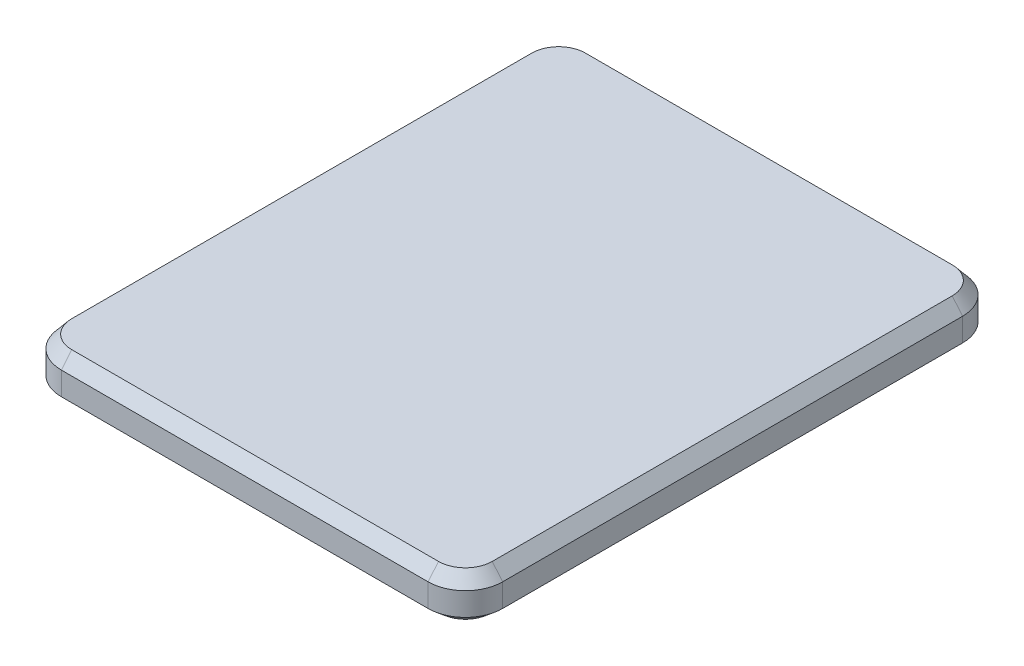
ISO-10303-21;
HEADER;
FILE_DESCRIPTION(('STEP AP214'),'2;1');
FILE_NAME('part.step','',(''),(''),'','','');
FILE_SCHEMA(('AUTOMOTIVE_DESIGN { 1 0 10303 214 1 1 1 1 }'));
ENDSEC;
DATA;
#1=APPLICATION_CONTEXT('core data for automotive mechanical design processes');
#2=APPLICATION_PROTOCOL_DEFINITION('international standard','automotive_design',2000,#1);
#3=PRODUCT_CONTEXT('',#1,'mechanical');
#4=PRODUCT('Part','Part','',(#3));
#5=PRODUCT_RELATED_PRODUCT_CATEGORY('part','',(#4));
#6=PRODUCT_DEFINITION_FORMATION('','',#4);
#7=PRODUCT_DEFINITION_CONTEXT('part definition',#1,'design');
#8=PRODUCT_DEFINITION('design','',#6,#7);
#9=PRODUCT_DEFINITION_SHAPE('','',#8);
#10=(LENGTH_UNIT() NAMED_UNIT(*) SI_UNIT(.MILLI.,.METRE.));
#11=(NAMED_UNIT(*) PLANE_ANGLE_UNIT() SI_UNIT($,.RADIAN.));
#12=(NAMED_UNIT(*) SI_UNIT($,.STERADIAN.) SOLID_ANGLE_UNIT());
#13=UNCERTAINTY_MEASURE_WITH_UNIT(LENGTH_MEASURE(1.E-05),#10,'distance_accuracy_value','');
#14=(GEOMETRIC_REPRESENTATION_CONTEXT(3) GLOBAL_UNCERTAINTY_ASSIGNED_CONTEXT((#13)) GLOBAL_UNIT_ASSIGNED_CONTEXT((#10,
#11,#12)) REPRESENTATION_CONTEXT('',''));
#15=CARTESIAN_POINT('',(0.,0.,0.));
#16=DIRECTION('',(0.,0.,1.));
#17=DIRECTION('',(1.,0.,0.));
#18=AXIS2_PLACEMENT_3D('',#15,#16,#17);
#19=CARTESIAN_POINT('',(17.75,3.7,-21.5));
#20=DIRECTION('',(-1.,0.,0.));
#21=DIRECTION('',(0.,0.,1.));
#22=AXIS2_PLACEMENT_3D('',#19,#20,#21);
#23=PLANE('',#22);
#24=DIRECTION('',(0.,-1.,0.));
#25=VECTOR('',#24,1.);
#26=CARTESIAN_POINT('',(17.75,3.7,18.5));
#27=LINE('',#26,#25);
#28=CARTESIAN_POINT('',(17.75,2.7,18.5));
#29=VERTEX_POINT('',#28);
#30=CARTESIAN_POINT('',(17.75,0.839099631177287,18.5));
#31=VERTEX_POINT('',#30);
#32=EDGE_CURVE('E296',#29,#31,#27,.T.);
#33=ORIENTED_EDGE('',*,*,#32,.T.);
#34=DIRECTION('',(0.,0.,-1.));
#35=VECTOR('',#34,1.);
#36=CARTESIAN_POINT('',(17.75,0.839099631177287,-21.5));
#37=LINE('',#36,#35);
#38=CARTESIAN_POINT('',(17.75,0.839099631177287,-18.5));
#39=VERTEX_POINT('',#38);
#40=EDGE_CURVE('E195',#31,#39,#37,.T.);
#41=ORIENTED_EDGE('',*,*,#40,.T.);
#42=DIRECTION('',(0.,-1.,0.));
#43=VECTOR('',#42,1.);
#44=CARTESIAN_POINT('',(17.75,3.7,-18.5));
#45=LINE('',#44,#43);
#46=CARTESIAN_POINT('',(17.75,2.7,-18.5));
#47=VERTEX_POINT('',#46);
#48=EDGE_CURVE('E299',#39,#47,#45,.F.);
#49=ORIENTED_EDGE('',*,*,#48,.T.);
#50=DIRECTION('',(0.,0.,1.));
#51=VECTOR('',#50,1.);
#52=CARTESIAN_POINT('',(17.75,2.7,18.5));
#53=LINE('',#52,#51);
#54=EDGE_CURVE('E193',#47,#29,#53,.T.);
#55=ORIENTED_EDGE('',*,*,#54,.T.);
#56=EDGE_LOOP('',(#33,#41,#49,#55));
#57=FACE_BOUND('',#56,.T.);
#58=ADVANCED_FACE('F37',(#57),#23,.F.);
#59=CARTESIAN_POINT('',(-17.75,3.7,-21.5));
#60=DIRECTION('',(0.,0.,1.));
#61=DIRECTION('',(1.,0.,0.));
#62=AXIS2_PLACEMENT_3D('',#59,#60,#61);
#63=PLANE('',#62);
#64=DIRECTION('',(0.,-1.,0.));
#65=VECTOR('',#64,1.);
#66=CARTESIAN_POINT('',(14.75,3.7,-21.5));
#67=LINE('',#66,#65);
#68=CARTESIAN_POINT('',(14.75,2.7,-21.5));
#69=VERTEX_POINT('',#68);
#70=CARTESIAN_POINT('',(14.75,0.839099631177287,-21.5));
#71=VERTEX_POINT('',#70);
#72=EDGE_CURVE('E288',#69,#71,#67,.T.);
#73=ORIENTED_EDGE('',*,*,#72,.T.);
#74=DIRECTION('',(-1.,0.,0.));
#75=VECTOR('',#74,1.);
#76=CARTESIAN_POINT('',(-17.75,0.839099631177287,-21.5));
#77=LINE('',#76,#75);
#78=CARTESIAN_POINT('',(-14.75,0.839099631177287,-21.5));
#79=VERTEX_POINT('',#78);
#80=EDGE_CURVE('E204',#71,#79,#77,.T.);
#81=ORIENTED_EDGE('',*,*,#80,.T.);
#82=DIRECTION('',(0.,-1.,0.));
#83=VECTOR('',#82,1.);
#84=CARTESIAN_POINT('',(-14.75,3.7,-21.5));
#85=LINE('',#84,#83);
#86=CARTESIAN_POINT('',(-14.75,2.7,-21.5));
#87=VERTEX_POINT('',#86);
#88=EDGE_CURVE('E293',#79,#87,#85,.F.);
#89=ORIENTED_EDGE('',*,*,#88,.T.);
#90=DIRECTION('',(1.,0.,0.));
#91=VECTOR('',#90,1.);
#92=CARTESIAN_POINT('',(14.75,2.7,-21.5));
#93=LINE('',#92,#91);
#94=EDGE_CURVE('E202',#87,#69,#93,.T.);
#95=ORIENTED_EDGE('',*,*,#94,.T.);
#96=EDGE_LOOP('',(#73,#81,#89,#95));
#97=FACE_BOUND('',#96,.T.);
#98=ADVANCED_FACE('F351',(#97),#63,.F.);
#99=CARTESIAN_POINT('',(-17.75,3.7,-21.5));
#100=DIRECTION('',(1.,0.,0.));
#101=DIRECTION('',(0.,0.,-1.));
#102=AXIS2_PLACEMENT_3D('',#99,#100,#101);
#103=PLANE('',#102);
#104=DIRECTION('',(0.,-1.,0.));
#105=VECTOR('',#104,1.);
#106=CARTESIAN_POINT('',(-17.75,3.7,-18.5));
#107=LINE('',#106,#105);
#108=CARTESIAN_POINT('',(-17.75,2.7,-18.5));
#109=VERTEX_POINT('',#108);
#110=CARTESIAN_POINT('',(-17.75,0.839099631177287,-18.5));
#111=VERTEX_POINT('',#110);
#112=EDGE_CURVE('E286',#109,#111,#107,.T.);
#113=ORIENTED_EDGE('',*,*,#112,.T.);
#114=DIRECTION('',(0.,0.,1.));
#115=VECTOR('',#114,1.);
#116=CARTESIAN_POINT('',(-17.75,0.839099631177287,-21.5));
#117=LINE('',#116,#115);
#118=CARTESIAN_POINT('',(-17.75,0.839099631177287,18.5));
#119=VERTEX_POINT('',#118);
#120=EDGE_CURVE('E212',#111,#119,#117,.T.);
#121=ORIENTED_EDGE('',*,*,#120,.T.);
#122=DIRECTION('',(0.,-1.,0.));
#123=VECTOR('',#122,1.);
#124=CARTESIAN_POINT('',(-17.75,3.7,18.5));
#125=LINE('',#124,#123);
#126=CARTESIAN_POINT('',(-17.75,2.7,18.5));
#127=VERTEX_POINT('',#126);
#128=EDGE_CURVE('E243',#119,#127,#125,.F.);
#129=ORIENTED_EDGE('',*,*,#128,.T.);
#130=DIRECTION('',(0.,0.,-1.));
#131=VECTOR('',#130,1.);
#132=CARTESIAN_POINT('',(-17.75,2.7,-18.5));
#133=LINE('',#132,#131);
#134=EDGE_CURVE('E210',#127,#109,#133,.T.);
#135=ORIENTED_EDGE('',*,*,#134,.T.);
#136=EDGE_LOOP('',(#113,#121,#129,#135));
#137=FACE_BOUND('',#136,.T.);
#138=ADVANCED_FACE('F284',(#137),#103,.F.);
#139=CARTESIAN_POINT('',(-17.75,3.7,21.5));
#140=DIRECTION('',(0.,0.,-1.));
#141=DIRECTION('',(-1.,0.,0.));
#142=AXIS2_PLACEMENT_3D('',#139,#140,#141);
#143=PLANE('',#142);
#144=DIRECTION('',(0.,-1.,0.));
#145=VECTOR('',#144,1.);
#146=CARTESIAN_POINT('',(-14.75,3.7,21.5));
#147=LINE('',#146,#145);
#148=CARTESIAN_POINT('',(-14.75,2.7,21.5));
#149=VERTEX_POINT('',#148);
#150=CARTESIAN_POINT('',(-14.75,0.839099631177287,21.5));
#151=VERTEX_POINT('',#150);
#152=EDGE_CURVE('E281',#149,#151,#147,.T.);
#153=ORIENTED_EDGE('',*,*,#152,.T.);
#154=DIRECTION('',(1.,0.,0.));
#155=VECTOR('',#154,1.);
#156=CARTESIAN_POINT('',(-17.75,0.839099631177287,21.5));
#157=LINE('',#156,#155);
#158=CARTESIAN_POINT('',(14.75,0.839099631177287,21.5));
#159=VERTEX_POINT('',#158);
#160=EDGE_CURVE('E187',#151,#159,#157,.T.);
#161=ORIENTED_EDGE('',*,*,#160,.T.);
#162=DIRECTION('',(0.,-1.,0.));
#163=VECTOR('',#162,1.);
#164=CARTESIAN_POINT('',(14.75,3.7,21.5));
#165=LINE('',#164,#163);
#166=CARTESIAN_POINT('',(14.75,2.7,21.5));
#167=VERTEX_POINT('',#166);
#168=EDGE_CURVE('E171',#159,#167,#165,.F.);
#169=ORIENTED_EDGE('',*,*,#168,.T.);
#170=DIRECTION('',(-1.,0.,0.));
#171=VECTOR('',#170,1.);
#172=CARTESIAN_POINT('',(-14.75,2.7,21.5));
#173=LINE('',#172,#171);
#174=EDGE_CURVE('E185',#167,#149,#173,.T.);
#175=ORIENTED_EDGE('',*,*,#174,.T.);
#176=EDGE_LOOP('',(#153,#161,#169,#175));
#177=FACE_BOUND('',#176,.T.);
#178=ADVANCED_FACE('F323',(#177),#143,.F.);
#179=CARTESIAN_POINT('',(0.,3.7,0.));
#180=DIRECTION('',(0.,1.,0.));
#181=DIRECTION('',(0.,0.,1.));
#182=AXIS2_PLACEMENT_3D('',#179,#180,#181);
#183=PLANE('',#182);
#184=DIRECTION('',(0.,0.,-1.));
#185=VECTOR('',#184,1.);
#186=CARTESIAN_POINT('',(16.9109003688227,3.7,-18.5));
#187=LINE('',#186,#185);
#188=CARTESIAN_POINT('',(16.9109003688227,3.7,18.5));
#189=VERTEX_POINT('',#188);
#190=CARTESIAN_POINT('',(16.9109003688227,3.7,-18.5));
#191=VERTEX_POINT('',#190);
#192=EDGE_CURVE('E47',#189,#191,#187,.T.);
#193=ORIENTED_EDGE('',*,*,#192,.T.);
#194=CARTESIAN_POINT('',(14.75,3.7,-18.5));
#195=DIRECTION('',(0.,1.,0.));
#196=DIRECTION('',(0.,0.,1.));
#197=AXIS2_PLACEMENT_3D('',#194,#195,#196);
#198=CIRCLE('',#197,2.16090036882272);
#199=CARTESIAN_POINT('',(14.75,3.7,-20.6609003688227));
#200=VERTEX_POINT('',#199);
#201=EDGE_CURVE('E11',#191,#200,#198,.T.);
#202=ORIENTED_EDGE('',*,*,#201,.T.);
#203=DIRECTION('',(-1.,0.,0.));
#204=VECTOR('',#203,1.);
#205=CARTESIAN_POINT('',(-14.75,3.7,-20.6609003688227));
#206=LINE('',#205,#204);
#207=CARTESIAN_POINT('',(-14.75,3.7,-20.6609003688227));
#208=VERTEX_POINT('',#207);
#209=EDGE_CURVE('E214',#200,#208,#206,.T.);
#210=ORIENTED_EDGE('',*,*,#209,.T.);
#211=CARTESIAN_POINT('',(-14.75,3.7,-18.5));
#212=DIRECTION('',(0.,1.,0.));
#213=DIRECTION('',(0.,0.,1.));
#214=AXIS2_PLACEMENT_3D('',#211,#212,#213);
#215=CIRCLE('',#214,2.16090036882272);
#216=CARTESIAN_POINT('',(-16.9109003688227,3.7,-18.5));
#217=VERTEX_POINT('',#216);
#218=EDGE_CURVE('E216',#208,#217,#215,.T.);
#219=ORIENTED_EDGE('',*,*,#218,.T.);
#220=DIRECTION('',(0.,0.,1.));
#221=VECTOR('',#220,1.);
#222=CARTESIAN_POINT('',(-16.9109003688227,3.7,18.5));
#223=LINE('',#222,#221);
#224=CARTESIAN_POINT('',(-16.9109003688227,3.7,18.5));
#225=VERTEX_POINT('',#224);
#226=EDGE_CURVE('E218',#217,#225,#223,.T.);
#227=ORIENTED_EDGE('',*,*,#226,.T.);
#228=CARTESIAN_POINT('',(-14.75,3.7,18.5));
#229=DIRECTION('',(0.,1.,0.));
#230=DIRECTION('',(0.,0.,1.));
#231=AXIS2_PLACEMENT_3D('',#228,#229,#230);
#232=CIRCLE('',#231,2.16090036882272);
#233=CARTESIAN_POINT('',(-14.75,3.7,20.6609003688227));
#234=VERTEX_POINT('',#233);
#235=EDGE_CURVE('E220',#225,#234,#232,.T.);
#236=ORIENTED_EDGE('',*,*,#235,.T.);
#237=DIRECTION('',(1.,0.,0.));
#238=VECTOR('',#237,1.);
#239=CARTESIAN_POINT('',(14.75,3.7,20.6609003688227));
#240=LINE('',#239,#238);
#241=CARTESIAN_POINT('',(14.75,3.7,20.6609003688227));
#242=VERTEX_POINT('',#241);
#243=EDGE_CURVE('E222',#234,#242,#240,.T.);
#244=ORIENTED_EDGE('',*,*,#243,.T.);
#245=CARTESIAN_POINT('',(14.75,3.7,18.5));
#246=DIRECTION('',(0.,1.,0.));
#247=DIRECTION('',(0.,0.,1.));
#248=AXIS2_PLACEMENT_3D('',#245,#246,#247);
#249=CIRCLE('',#248,2.16090036882272);
#250=EDGE_CURVE('E58',#242,#189,#249,.T.);
#251=ORIENTED_EDGE('',*,*,#250,.T.);
#252=EDGE_LOOP('',(#193,#202,#210,#219,#227,#236,#244,#251));
#253=FACE_BOUND('',#252,.T.);
#254=ADVANCED_FACE('F339',(#253),#183,.T.);
#255=CARTESIAN_POINT('',(0.,0.,0.));
#256=DIRECTION('',(0.,1.,0.));
#257=DIRECTION('',(0.,0.,1.));
#258=AXIS2_PLACEMENT_3D('',#255,#256,#257);
#259=PLANE('',#258);
#260=DIRECTION('',(-1.,0.,0.));
#261=VECTOR('',#260,1.);
#262=CARTESIAN_POINT('',(0.,0.,20.5));
#263=LINE('',#262,#261);
#264=CARTESIAN_POINT('',(14.75,0.,20.5));
#265=VERTEX_POINT('',#264);
#266=CARTESIAN_POINT('',(-14.75,0.,20.5));
#267=VERTEX_POINT('',#266);
#268=EDGE_CURVE('E175',#265,#267,#263,.T.);
#269=ORIENTED_EDGE('',*,*,#268,.T.);
#270=CARTESIAN_POINT('',(-14.75,0.,18.5));
#271=DIRECTION('',(0.,1.,0.));
#272=DIRECTION('',(0.,0.,1.));
#273=AXIS2_PLACEMENT_3D('',#270,#271,#272);
#274=CIRCLE('',#273,1.99999999999999);
#275=CARTESIAN_POINT('',(-16.75,0.,18.5));
#276=VERTEX_POINT('',#275);
#277=EDGE_CURVE('E156',#267,#276,#274,.F.);
#278=ORIENTED_EDGE('',*,*,#277,.T.);
#279=DIRECTION('',(0.,0.,-1.));
#280=VECTOR('',#279,1.);
#281=CARTESIAN_POINT('',(-16.75,0.,0.));
#282=LINE('',#281,#280);
#283=CARTESIAN_POINT('',(-16.75,0.,-18.5));
#284=VERTEX_POINT('',#283);
#285=EDGE_CURVE('E164',#276,#284,#282,.T.);
#286=ORIENTED_EDGE('',*,*,#285,.T.);
#287=CARTESIAN_POINT('',(-14.75,0.,-18.5));
#288=DIRECTION('',(0.,1.,0.));
#289=DIRECTION('',(0.,0.,1.));
#290=AXIS2_PLACEMENT_3D('',#287,#288,#289);
#291=CIRCLE('',#290,1.99999999999999);
#292=CARTESIAN_POINT('',(-14.75,0.,-20.5));
#293=VERTEX_POINT('',#292);
#294=EDGE_CURVE('E170',#284,#293,#291,.F.);
#295=ORIENTED_EDGE('',*,*,#294,.T.);
#296=DIRECTION('',(1.,0.,0.));
#297=VECTOR('',#296,1.);
#298=CARTESIAN_POINT('',(0.,0.,-20.5));
#299=LINE('',#298,#297);
#300=CARTESIAN_POINT('',(14.75,0.,-20.5));
#301=VERTEX_POINT('',#300);
#302=EDGE_CURVE('E306',#293,#301,#299,.T.);
#303=ORIENTED_EDGE('',*,*,#302,.T.);
#304=CARTESIAN_POINT('',(14.75,0.,-18.5));
#305=DIRECTION('',(0.,1.,0.));
#306=DIRECTION('',(0.,0.,1.));
#307=AXIS2_PLACEMENT_3D('',#304,#305,#306);
#308=CIRCLE('',#307,1.99999999999999);
#309=CARTESIAN_POINT('',(16.75,0.,-18.5));
#310=VERTEX_POINT('',#309);
#311=EDGE_CURVE('E308',#301,#310,#308,.F.);
#312=ORIENTED_EDGE('',*,*,#311,.T.);
#313=DIRECTION('',(0.,0.,1.));
#314=VECTOR('',#313,1.);
#315=CARTESIAN_POINT('',(16.75,0.,0.));
#316=LINE('',#315,#314);
#317=CARTESIAN_POINT('',(16.75,0.,18.5));
#318=VERTEX_POINT('',#317);
#319=EDGE_CURVE('E310',#310,#318,#316,.T.);
#320=ORIENTED_EDGE('',*,*,#319,.T.);
#321=CARTESIAN_POINT('',(14.75,0.,18.5));
#322=DIRECTION('',(0.,1.,0.));
#323=DIRECTION('',(0.,0.,1.));
#324=AXIS2_PLACEMENT_3D('',#321,#322,#323);
#325=CIRCLE('',#324,1.99999999999999);
#326=EDGE_CURVE('E180',#318,#265,#325,.F.);
#327=ORIENTED_EDGE('',*,*,#326,.T.);
#328=EDGE_LOOP('',(#269,#278,#286,#295,#303,#312,#320,#327));
#329=FACE_BOUND('',#328,.T.);
#330=ADVANCED_FACE('F173',(#329),#259,.F.);
#331=CARTESIAN_POINT('',(-14.75,3.7,-18.5));
#332=DIRECTION('',(0.,-1.,0.));
#333=DIRECTION('',(0.,0.,-1.));
#334=AXIS2_PLACEMENT_3D('',#331,#332,#333);
#335=CYLINDRICAL_SURFACE('',#334,3.);
#336=ORIENTED_EDGE('',*,*,#88,.F.);
#337=CARTESIAN_POINT('',(-14.75,0.839099631177287,-18.5));
#338=DIRECTION('',(0.,1.,0.));
#339=DIRECTION('',(0.,0.,1.));
#340=AXIS2_PLACEMENT_3D('',#337,#338,#339);
#341=CIRCLE('',#340,3.);
#342=EDGE_CURVE('E208',#79,#111,#341,.T.);
#343=ORIENTED_EDGE('',*,*,#342,.T.);
#344=ORIENTED_EDGE('',*,*,#112,.F.);
#345=CARTESIAN_POINT('',(-14.75,2.7,-18.5));
#346=DIRECTION('',(0.,1.,0.));
#347=DIRECTION('',(0.,0.,1.));
#348=AXIS2_PLACEMENT_3D('',#345,#346,#347);
#349=CIRCLE('',#348,3.);
#350=EDGE_CURVE('E206',#109,#87,#349,.F.);
#351=ORIENTED_EDGE('',*,*,#350,.T.);
#352=EDGE_LOOP('',(#336,#343,#344,#351));
#353=FACE_BOUND('',#352,.T.);
#354=ADVANCED_FACE('F375',(#353),#335,.T.);
#355=CARTESIAN_POINT('',(14.75,3.7,-18.5));
#356=DIRECTION('',(0.,-1.,0.));
#357=DIRECTION('',(0.,0.,-1.));
#358=AXIS2_PLACEMENT_3D('',#355,#356,#357);
#359=CYLINDRICAL_SURFACE('',#358,3.);
#360=ORIENTED_EDGE('',*,*,#48,.F.);
#361=CARTESIAN_POINT('',(14.75,0.839099631177287,-18.5));
#362=DIRECTION('',(0.,1.,0.));
#363=DIRECTION('',(0.,0.,1.));
#364=AXIS2_PLACEMENT_3D('',#361,#362,#363);
#365=CIRCLE('',#364,3.);
#366=EDGE_CURVE('E200',#39,#71,#365,.T.);
#367=ORIENTED_EDGE('',*,*,#366,.T.);
#368=ORIENTED_EDGE('',*,*,#72,.F.);
#369=CARTESIAN_POINT('',(14.75,2.7,-18.5));
#370=DIRECTION('',(0.,1.,0.));
#371=DIRECTION('',(0.,0.,1.));
#372=AXIS2_PLACEMENT_3D('',#369,#370,#371);
#373=CIRCLE('',#372,3.);
#374=EDGE_CURVE('E197',#69,#47,#373,.F.);
#375=ORIENTED_EDGE('',*,*,#374,.T.);
#376=EDGE_LOOP('',(#360,#367,#368,#375));
#377=FACE_BOUND('',#376,.T.);
#378=ADVANCED_FACE('F356',(#377),#359,.T.);
#379=CARTESIAN_POINT('',(14.75,3.7,18.5));
#380=DIRECTION('',(0.,-1.,0.));
#381=DIRECTION('',(0.,0.,-1.));
#382=AXIS2_PLACEMENT_3D('',#379,#380,#381);
#383=CYLINDRICAL_SURFACE('',#382,3.);
#384=ORIENTED_EDGE('',*,*,#168,.F.);
#385=CARTESIAN_POINT('',(14.75,0.839099631177287,18.5));
#386=DIRECTION('',(0.,1.,0.));
#387=DIRECTION('',(0.,0.,1.));
#388=AXIS2_PLACEMENT_3D('',#385,#386,#387);
#389=CIRCLE('',#388,3.);
#390=EDGE_CURVE('E191',#159,#31,#389,.T.);
#391=ORIENTED_EDGE('',*,*,#390,.T.);
#392=ORIENTED_EDGE('',*,*,#32,.F.);
#393=CARTESIAN_POINT('',(14.75,2.7,18.5));
#394=DIRECTION('',(0.,1.,0.));
#395=DIRECTION('',(0.,0.,1.));
#396=AXIS2_PLACEMENT_3D('',#393,#394,#395);
#397=CIRCLE('',#396,3.);
#398=EDGE_CURVE('E189',#29,#167,#397,.F.);
#399=ORIENTED_EDGE('',*,*,#398,.T.);
#400=EDGE_LOOP('',(#384,#391,#392,#399));
#401=FACE_BOUND('',#400,.T.);
#402=ADVANCED_FACE('F325',(#401),#383,.T.);
#403=CARTESIAN_POINT('',(-14.75,3.7,18.5));
#404=DIRECTION('',(0.,-1.,0.));
#405=DIRECTION('',(0.,0.,-1.));
#406=AXIS2_PLACEMENT_3D('',#403,#404,#405);
#407=CYLINDRICAL_SURFACE('',#406,3.);
#408=ORIENTED_EDGE('',*,*,#128,.F.);
#409=CARTESIAN_POINT('',(-14.75,0.839099631177287,18.5));
#410=DIRECTION('',(0.,1.,0.));
#411=DIRECTION('',(0.,0.,1.));
#412=AXIS2_PLACEMENT_3D('',#409,#410,#411);
#413=CIRCLE('',#412,3.);
#414=EDGE_CURVE('E158',#119,#151,#413,.T.);
#415=ORIENTED_EDGE('',*,*,#414,.T.);
#416=ORIENTED_EDGE('',*,*,#152,.F.);
#417=CARTESIAN_POINT('',(-14.75,2.7,18.5));
#418=DIRECTION('',(0.,1.,0.));
#419=DIRECTION('',(0.,0.,1.));
#420=AXIS2_PLACEMENT_3D('',#417,#418,#419);
#421=CIRCLE('',#420,3.);
#422=EDGE_CURVE('E177',#149,#127,#421,.F.);
#423=ORIENTED_EDGE('',*,*,#422,.T.);
#424=EDGE_LOOP('',(#408,#415,#416,#423));
#425=FACE_BOUND('',#424,.T.);
#426=ADVANCED_FACE('F279',(#425),#407,.T.);
#427=CARTESIAN_POINT('',(14.75,0.,-18.5));
#428=DIRECTION('',(0.,1.,0.));
#429=DIRECTION('',(0.,0.,1.));
#430=AXIS2_PLACEMENT_3D('',#427,#428,#429);
#431=CONICAL_SURFACE('',#430,1.99999999999999,0.872664625997165);
#432=DIRECTION('',(0.,-0.642787609686539,0.766044443118978));
#433=VECTOR('',#432,1.);
#434=CARTESIAN_POINT('',(14.75,0.839099631177287,-21.5));
#435=LINE('',#434,#433);
#436=EDGE_CURVE('E237',#71,#301,#435,.T.);
#437=ORIENTED_EDGE('',*,*,#436,.F.);
#438=ORIENTED_EDGE('',*,*,#366,.F.);
#439=DIRECTION('',(0.766044443118978,0.642787609686539,0.));
#440=VECTOR('',#439,1.);
#441=CARTESIAN_POINT('',(16.75,0.,-18.5));
#442=LINE('',#441,#440);
#443=EDGE_CURVE('E240',#310,#39,#442,.T.);
#444=ORIENTED_EDGE('',*,*,#443,.F.);
#445=ORIENTED_EDGE('',*,*,#311,.F.);
#446=EDGE_LOOP('',(#437,#438,#444,#445));
#447=FACE_BOUND('',#446,.T.);
#448=ADVANCED_FACE('F360',(#447),#431,.T.);
#449=CARTESIAN_POINT('',(17.75,0.839099631177287,-21.5));
#450=DIRECTION('',(-0.642787609686539,0.766044443118978,0.));
#451=DIRECTION('',(0.,0.,-1.));
#452=AXIS2_PLACEMENT_3D('',#449,#450,#451);
#453=PLANE('',#452);
#454=ORIENTED_EDGE('',*,*,#443,.T.);
#455=ORIENTED_EDGE('',*,*,#40,.F.);
#456=DIRECTION('',(0.766044443118978,0.642787609686539,0.));
#457=VECTOR('',#456,1.);
#458=CARTESIAN_POINT('',(16.75,0.,18.5));
#459=LINE('',#458,#457);
#460=EDGE_CURVE('E234',#318,#31,#459,.T.);
#461=ORIENTED_EDGE('',*,*,#460,.F.);
#462=ORIENTED_EDGE('',*,*,#319,.F.);
#463=EDGE_LOOP('',(#454,#455,#461,#462));
#464=FACE_BOUND('',#463,.T.);
#465=ADVANCED_FACE('F365',(#464),#453,.F.);
#466=CARTESIAN_POINT('',(-17.75,0.839099631177287,-21.5));
#467=DIRECTION('',(0.,0.766044443118978,0.642787609686539));
#468=DIRECTION('',(-1.,0.,0.));
#469=AXIS2_PLACEMENT_3D('',#466,#467,#468);
#470=PLANE('',#469);
#471=ORIENTED_EDGE('',*,*,#436,.T.);
#472=ORIENTED_EDGE('',*,*,#302,.F.);
#473=DIRECTION('',(0.,-0.642787609686539,0.766044443118978));
#474=VECTOR('',#473,1.);
#475=CARTESIAN_POINT('',(-14.75,0.839099631177287,-21.5));
#476=LINE('',#475,#474);
#477=EDGE_CURVE('E231',#79,#293,#476,.T.);
#478=ORIENTED_EDGE('',*,*,#477,.F.);
#479=ORIENTED_EDGE('',*,*,#80,.F.);
#480=EDGE_LOOP('',(#471,#472,#478,#479));
#481=FACE_BOUND('',#480,.T.);
#482=ADVANCED_FACE('F413',(#481),#470,.F.);
#483=CARTESIAN_POINT('',(14.75,0.,18.5));
#484=DIRECTION('',(0.,1.,0.));
#485=DIRECTION('',(0.,0.,1.));
#486=AXIS2_PLACEMENT_3D('',#483,#484,#485);
#487=CONICAL_SURFACE('',#486,1.99999999999999,0.872664625997165);
#488=ORIENTED_EDGE('',*,*,#460,.T.);
#489=ORIENTED_EDGE('',*,*,#390,.F.);
#490=DIRECTION('',(0.,0.642787609686539,0.766044443118978));
#491=VECTOR('',#490,1.);
#492=CARTESIAN_POINT('',(14.75,0.,20.5));
#493=LINE('',#492,#491);
#494=EDGE_CURVE('E228',#265,#159,#493,.T.);
#495=ORIENTED_EDGE('',*,*,#494,.F.);
#496=ORIENTED_EDGE('',*,*,#326,.F.);
#497=EDGE_LOOP('',(#488,#489,#495,#496));
#498=FACE_BOUND('',#497,.T.);
#499=ADVANCED_FACE('F317',(#498),#487,.T.);
#500=CARTESIAN_POINT('',(-14.75,0.,-18.5));
#501=DIRECTION('',(0.,1.,0.));
#502=DIRECTION('',(0.,0.,1.));
#503=AXIS2_PLACEMENT_3D('',#500,#501,#502);
#504=CONICAL_SURFACE('',#503,1.99999999999999,0.872664625997165);
#505=ORIENTED_EDGE('',*,*,#477,.T.);
#506=ORIENTED_EDGE('',*,*,#294,.F.);
#507=DIRECTION('',(0.766044443118978,-0.642787609686539,0.));
#508=VECTOR('',#507,1.);
#509=CARTESIAN_POINT('',(-17.75,0.839099631177287,-18.5));
#510=LINE('',#509,#508);
#511=EDGE_CURVE('E167',#111,#284,#510,.T.);
#512=ORIENTED_EDGE('',*,*,#511,.F.);
#513=ORIENTED_EDGE('',*,*,#342,.F.);
#514=EDGE_LOOP('',(#505,#506,#512,#513));
#515=FACE_BOUND('',#514,.T.);
#516=ADVANCED_FACE('F401',(#515),#504,.T.);
#517=CARTESIAN_POINT('',(-17.75,0.839099631177287,21.5));
#518=DIRECTION('',(0.,0.766044443118978,-0.642787609686539));
#519=DIRECTION('',(1.,0.,0.));
#520=AXIS2_PLACEMENT_3D('',#517,#518,#519);
#521=PLANE('',#520);
#522=ORIENTED_EDGE('',*,*,#494,.T.);
#523=ORIENTED_EDGE('',*,*,#160,.F.);
#524=DIRECTION('',(0.,0.642787609686539,0.766044443118978));
#525=VECTOR('',#524,1.);
#526=CARTESIAN_POINT('',(-14.75,0.,20.5));
#527=LINE('',#526,#525);
#528=EDGE_CURVE('E161',#267,#151,#527,.T.);
#529=ORIENTED_EDGE('',*,*,#528,.F.);
#530=ORIENTED_EDGE('',*,*,#268,.F.);
#531=EDGE_LOOP('',(#522,#523,#529,#530));
#532=FACE_BOUND('',#531,.T.);
#533=ADVANCED_FACE('F320',(#532),#521,.F.);
#534=CARTESIAN_POINT('',(-17.75,0.839099631177287,-21.5));
#535=DIRECTION('',(0.642787609686539,0.766044443118978,0.));
#536=DIRECTION('',(0.,0.,1.));
#537=AXIS2_PLACEMENT_3D('',#534,#535,#536);
#538=PLANE('',#537);
#539=ORIENTED_EDGE('',*,*,#511,.T.);
#540=ORIENTED_EDGE('',*,*,#285,.F.);
#541=DIRECTION('',(0.766044443118978,-0.642787609686539,0.));
#542=VECTOR('',#541,1.);
#543=CARTESIAN_POINT('',(-17.75,0.839099631177287,18.5));
#544=LINE('',#543,#542);
#545=EDGE_CURVE('E152',#119,#276,#544,.T.);
#546=ORIENTED_EDGE('',*,*,#545,.F.);
#547=ORIENTED_EDGE('',*,*,#120,.F.);
#548=EDGE_LOOP('',(#539,#540,#546,#547));
#549=FACE_BOUND('',#548,.T.);
#550=ADVANCED_FACE('F165',(#549),#538,.F.);
#551=CARTESIAN_POINT('',(-14.75,0.,18.5));
#552=DIRECTION('',(0.,1.,0.));
#553=DIRECTION('',(0.,0.,1.));
#554=AXIS2_PLACEMENT_3D('',#551,#552,#553);
#555=CONICAL_SURFACE('',#554,1.99999999999999,0.872664625997165);
#556=ORIENTED_EDGE('',*,*,#528,.T.);
#557=ORIENTED_EDGE('',*,*,#414,.F.);
#558=ORIENTED_EDGE('',*,*,#545,.T.);
#559=ORIENTED_EDGE('',*,*,#277,.F.);
#560=EDGE_LOOP('',(#556,#557,#558,#559));
#561=FACE_BOUND('',#560,.T.);
#562=ADVANCED_FACE('F154',(#561),#555,.T.);
#563=CARTESIAN_POINT('',(-14.75,3.7,18.5));
#564=DIRECTION('',(0.,-1.,0.));
#565=DIRECTION('',(0.,0.,-1.));
#566=AXIS2_PLACEMENT_3D('',#563,#564,#565);
#567=CONICAL_SURFACE('',#566,2.16090036882272,0.698131700797732);
#568=DIRECTION('',(0.642787609686539,0.766044443118978,0.));
#569=VECTOR('',#568,1.);
#570=CARTESIAN_POINT('',(-17.75,2.7,18.5));
#571=LINE('',#570,#569);
#572=EDGE_CURVE('E259',#127,#225,#571,.T.);
#573=ORIENTED_EDGE('',*,*,#572,.F.);
#574=ORIENTED_EDGE('',*,*,#422,.F.);
#575=DIRECTION('',(0.,-0.766044443118978,0.642787609686539));
#576=VECTOR('',#575,1.);
#577=CARTESIAN_POINT('',(-14.75,3.7,20.6609003688227));
#578=LINE('',#577,#576);
#579=EDGE_CURVE('E42',#234,#149,#578,.T.);
#580=ORIENTED_EDGE('',*,*,#579,.F.);
#581=ORIENTED_EDGE('',*,*,#235,.F.);
#582=EDGE_LOOP('',(#573,#574,#580,#581));
#583=FACE_BOUND('',#582,.T.);
#584=ADVANCED_FACE('F40',(#583),#567,.T.);
#585=CARTESIAN_POINT('',(0.,3.7,20.6609003688227));
#586=DIRECTION('',(0.,0.642787609686539,0.766044443118978));
#587=DIRECTION('',(-1.,0.,0.));
#588=AXIS2_PLACEMENT_3D('',#585,#586,#587);
#589=PLANE('',#588);
#590=ORIENTED_EDGE('',*,*,#579,.T.);
#591=ORIENTED_EDGE('',*,*,#174,.F.);
#592=DIRECTION('',(0.,-0.766044443118978,0.642787609686539));
#593=VECTOR('',#592,1.);
#594=CARTESIAN_POINT('',(14.75,3.7,20.6609003688227));
#595=LINE('',#594,#593);
#596=EDGE_CURVE('E257',#242,#167,#595,.T.);
#597=ORIENTED_EDGE('',*,*,#596,.F.);
#598=ORIENTED_EDGE('',*,*,#243,.F.);
#599=EDGE_LOOP('',(#590,#591,#597,#598));
#600=FACE_BOUND('',#599,.T.);
#601=ADVANCED_FACE('F270',(#600),#589,.T.);
#602=CARTESIAN_POINT('',(-16.9109003688227,3.7,0.));
#603=DIRECTION('',(-0.766044443118978,0.642787609686539,0.));
#604=DIRECTION('',(0.,0.,-1.));
#605=AXIS2_PLACEMENT_3D('',#602,#603,#604);
#606=PLANE('',#605);
#607=ORIENTED_EDGE('',*,*,#572,.T.);
#608=ORIENTED_EDGE('',*,*,#226,.F.);
#609=DIRECTION('',(0.642787609686539,0.766044443118978,0.));
#610=VECTOR('',#609,1.);
#611=CARTESIAN_POINT('',(-17.75,2.7,-18.5));
#612=LINE('',#611,#610);
#613=EDGE_CURVE('E254',#109,#217,#612,.T.);
#614=ORIENTED_EDGE('',*,*,#613,.F.);
#615=ORIENTED_EDGE('',*,*,#134,.F.);
#616=EDGE_LOOP('',(#607,#608,#614,#615));
#617=FACE_BOUND('',#616,.T.);
#618=ADVANCED_FACE('F455',(#617),#606,.T.);
#619=CARTESIAN_POINT('',(14.75,3.7,18.5));
#620=DIRECTION('',(0.,-1.,0.));
#621=DIRECTION('',(0.,0.,-1.));
#622=AXIS2_PLACEMENT_3D('',#619,#620,#621);
#623=CONICAL_SURFACE('',#622,2.16090036882272,0.698131700797732);
#624=ORIENTED_EDGE('',*,*,#596,.T.);
#625=ORIENTED_EDGE('',*,*,#398,.F.);
#626=DIRECTION('',(0.642787609686539,-0.766044443118978,0.));
#627=VECTOR('',#626,1.);
#628=CARTESIAN_POINT('',(16.9109003688227,3.7,18.5));
#629=LINE('',#628,#627);
#630=EDGE_CURVE('E251',#189,#29,#629,.T.);
#631=ORIENTED_EDGE('',*,*,#630,.F.);
#632=ORIENTED_EDGE('',*,*,#250,.F.);
#633=EDGE_LOOP('',(#624,#625,#631,#632));
#634=FACE_BOUND('',#633,.T.);
#635=ADVANCED_FACE('F329',(#634),#623,.T.);
#636=CARTESIAN_POINT('',(-14.75,3.7,-18.5));
#637=DIRECTION('',(0.,-1.,0.));
#638=DIRECTION('',(0.,0.,-1.));
#639=AXIS2_PLACEMENT_3D('',#636,#637,#638);
#640=CONICAL_SURFACE('',#639,2.16090036882272,0.698131700797732);
#641=ORIENTED_EDGE('',*,*,#613,.T.);
#642=ORIENTED_EDGE('',*,*,#218,.F.);
#643=DIRECTION('',(0.,0.766044443118978,0.642787609686539));
#644=VECTOR('',#643,1.);
#645=CARTESIAN_POINT('',(-14.75,2.7,-21.5));
#646=LINE('',#645,#644);
#647=EDGE_CURVE('E248',#87,#208,#646,.T.);
#648=ORIENTED_EDGE('',*,*,#647,.F.);
#649=ORIENTED_EDGE('',*,*,#350,.F.);
#650=EDGE_LOOP('',(#641,#642,#648,#649));
#651=FACE_BOUND('',#650,.T.);
#652=ADVANCED_FACE('F344',(#651),#640,.T.);
#653=CARTESIAN_POINT('',(16.9109003688227,3.7,0.));
#654=DIRECTION('',(0.766044443118978,0.642787609686539,0.));
#655=DIRECTION('',(0.,0.,1.));
#656=AXIS2_PLACEMENT_3D('',#653,#654,#655);
#657=PLANE('',#656);
#658=ORIENTED_EDGE('',*,*,#630,.T.);
#659=ORIENTED_EDGE('',*,*,#54,.F.);
#660=DIRECTION('',(0.642787609686539,-0.766044443118978,0.));
#661=VECTOR('',#660,1.);
#662=CARTESIAN_POINT('',(16.9109003688227,3.7,-18.5));
#663=LINE('',#662,#661);
#664=EDGE_CURVE('E246',#191,#47,#663,.T.);
#665=ORIENTED_EDGE('',*,*,#664,.F.);
#666=ORIENTED_EDGE('',*,*,#192,.F.);
#667=EDGE_LOOP('',(#658,#659,#665,#666));
#668=FACE_BOUND('',#667,.T.);
#669=ADVANCED_FACE('F332',(#668),#657,.T.);
#670=CARTESIAN_POINT('',(0.,3.7,-20.6609003688227));
#671=DIRECTION('',(0.,0.642787609686539,-0.766044443118978));
#672=DIRECTION('',(1.,0.,0.));
#673=AXIS2_PLACEMENT_3D('',#670,#671,#672);
#674=PLANE('',#673);
#675=ORIENTED_EDGE('',*,*,#647,.T.);
#676=ORIENTED_EDGE('',*,*,#209,.F.);
#677=DIRECTION('',(0.,0.766044443118978,0.642787609686539));
#678=VECTOR('',#677,1.);
#679=CARTESIAN_POINT('',(14.75,2.7,-21.5));
#680=LINE('',#679,#678);
#681=EDGE_CURVE('E244',#69,#200,#680,.T.);
#682=ORIENTED_EDGE('',*,*,#681,.F.);
#683=ORIENTED_EDGE('',*,*,#94,.F.);
#684=EDGE_LOOP('',(#675,#676,#682,#683));
#685=FACE_BOUND('',#684,.T.);
#686=ADVANCED_FACE('F348',(#685),#674,.T.);
#687=CARTESIAN_POINT('',(14.75,3.7,-18.5));
#688=DIRECTION('',(0.,-1.,0.));
#689=DIRECTION('',(0.,0.,-1.));
#690=AXIS2_PLACEMENT_3D('',#687,#688,#689);
#691=CONICAL_SURFACE('',#690,2.16090036882272,0.698131700797732);
#692=ORIENTED_EDGE('',*,*,#664,.T.);
#693=ORIENTED_EDGE('',*,*,#374,.F.);
#694=ORIENTED_EDGE('',*,*,#681,.T.);
#695=ORIENTED_EDGE('',*,*,#201,.F.);
#696=EDGE_LOOP('',(#692,#693,#694,#695));
#697=FACE_BOUND('',#696,.T.);
#698=ADVANCED_FACE('F336',(#697),#691,.T.);
#699=CLOSED_SHELL('',(#58,#98,#138,#178,#254,#330,#354,#378,#402,#426,#448,#465,#482,#499,#516,
#533,#550,#562,#584,#601,#618,#635,#652,#669,#686,#698));
#700=MANIFOLD_SOLID_BREP('B2',#699);
#701=ADVANCED_BREP_SHAPE_REPRESENTATION('',(#18,#700),#14);
#702=SHAPE_DEFINITION_REPRESENTATION(#9,#701);
ENDSEC;
END-ISO-10303-21;
